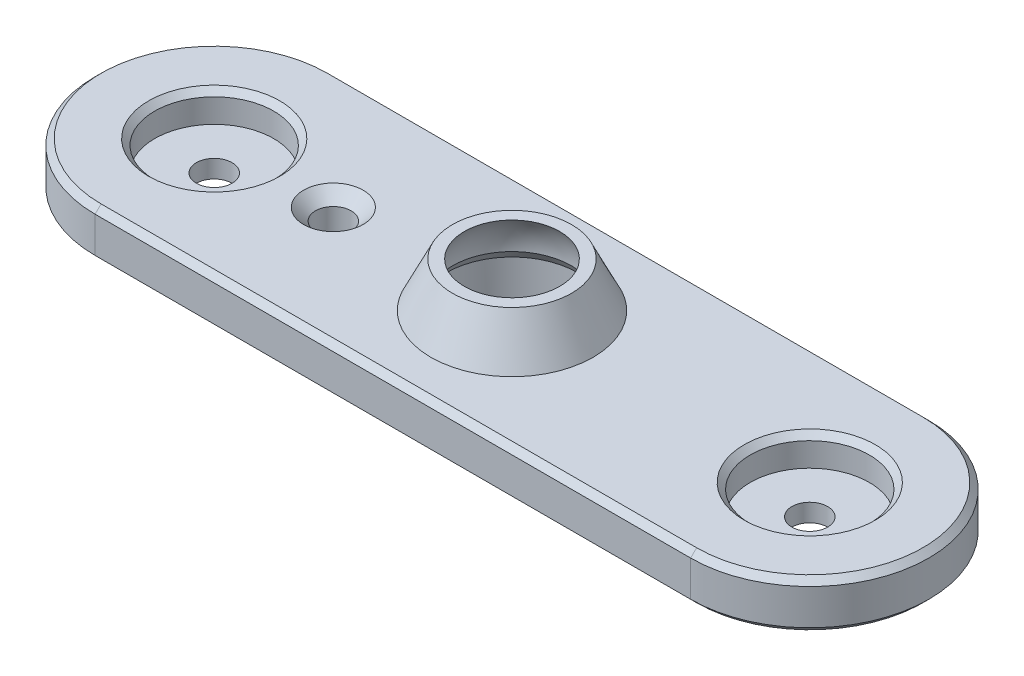
ISO-10303-21;
HEADER;
FILE_DESCRIPTION(('STEP AP214'),'2;1');
FILE_NAME('part.step','',(''),(''),'','','');
FILE_SCHEMA(('AUTOMOTIVE_DESIGN { 1 0 10303 214 1 1 1 1 }'));
ENDSEC;
DATA;
#1=APPLICATION_CONTEXT('core data for automotive mechanical design processes');
#2=APPLICATION_PROTOCOL_DEFINITION('international standard','automotive_design',2000,#1);
#3=PRODUCT_CONTEXT('',#1,'mechanical');
#4=PRODUCT('Part','Part','',(#3));
#5=PRODUCT_RELATED_PRODUCT_CATEGORY('part','',(#4));
#6=PRODUCT_DEFINITION_FORMATION('','',#4);
#7=PRODUCT_DEFINITION_CONTEXT('part definition',#1,'design');
#8=PRODUCT_DEFINITION('design','',#6,#7);
#9=PRODUCT_DEFINITION_SHAPE('','',#8);
#10=(LENGTH_UNIT() NAMED_UNIT(*) SI_UNIT(.MILLI.,.METRE.));
#11=(NAMED_UNIT(*) PLANE_ANGLE_UNIT() SI_UNIT($,.RADIAN.));
#12=(NAMED_UNIT(*) SI_UNIT($,.STERADIAN.) SOLID_ANGLE_UNIT());
#13=UNCERTAINTY_MEASURE_WITH_UNIT(LENGTH_MEASURE(1.E-05),#10,'distance_accuracy_value','');
#14=(GEOMETRIC_REPRESENTATION_CONTEXT(3) GLOBAL_UNCERTAINTY_ASSIGNED_CONTEXT((#13)) GLOBAL_UNIT_ASSIGNED_CONTEXT((#10,
#11,#12)) REPRESENTATION_CONTEXT('',''));
#15=CARTESIAN_POINT('',(0.,0.,0.));
#16=DIRECTION('',(0.,0.,1.));
#17=DIRECTION('',(1.,0.,0.));
#18=AXIS2_PLACEMENT_3D('',#15,#16,#17);
#19=CARTESIAN_POINT('',(25.,4.,0.));
#20=DIRECTION('',(0.,-1.,0.));
#21=DIRECTION('',(0.,0.,-1.));
#22=AXIS2_PLACEMENT_3D('',#19,#20,#21);
#23=CYLINDRICAL_SURFACE('',#22,1.5);
#24=CARTESIAN_POINT('',(25.,0.,0.));
#25=DIRECTION('',(0.,1.,0.));
#26=DIRECTION('',(0.,0.,1.));
#27=AXIS2_PLACEMENT_3D('',#24,#25,#26);
#28=CIRCLE('',#27,1.5);
#29=CARTESIAN_POINT('',(25.,0.,1.49999999999999));
#30=VERTEX_POINT('',#29);
#31=EDGE_CURVE('E208',#30,#30,#28,.T.);
#32=ORIENTED_EDGE('',*,*,#31,.F.);
#33=EDGE_LOOP('',(#32));
#34=FACE_BOUND('',#33,.T.);
#35=CARTESIAN_POINT('',(25.,1.5,0.));
#36=DIRECTION('',(0.,1.,0.));
#37=DIRECTION('',(0.,0.,1.));
#38=AXIS2_PLACEMENT_3D('',#35,#36,#37);
#39=CIRCLE('',#38,1.5);
#40=CARTESIAN_POINT('',(25.,1.5,1.49999999999999));
#41=VERTEX_POINT('',#40);
#42=EDGE_CURVE('E200',#41,#41,#39,.T.);
#43=ORIENTED_EDGE('',*,*,#42,.T.);
#44=EDGE_LOOP('',(#43));
#45=FACE_BOUND('',#44,.T.);
#46=ADVANCED_FACE('F34',(#34,#45),#23,.F.);
#47=CARTESIAN_POINT('',(-25.,4.,0.));
#48=DIRECTION('',(0.,-1.,0.));
#49=DIRECTION('',(0.,0.,-1.));
#50=AXIS2_PLACEMENT_3D('',#47,#48,#49);
#51=CYLINDRICAL_SURFACE('',#50,1.5);
#52=CARTESIAN_POINT('',(-25.,0.,0.));
#53=DIRECTION('',(0.,1.,0.));
#54=DIRECTION('',(0.,0.,1.));
#55=AXIS2_PLACEMENT_3D('',#52,#53,#54);
#56=CIRCLE('',#55,1.5);
#57=CARTESIAN_POINT('',(-25.,0.,1.5));
#58=VERTEX_POINT('',#57);
#59=EDGE_CURVE('E220',#58,#58,#56,.T.);
#60=ORIENTED_EDGE('',*,*,#59,.F.);
#61=EDGE_LOOP('',(#60));
#62=FACE_BOUND('',#61,.T.);
#63=CARTESIAN_POINT('',(-25.,1.5,0.));
#64=DIRECTION('',(0.,1.,0.));
#65=DIRECTION('',(0.,0.,1.));
#66=AXIS2_PLACEMENT_3D('',#63,#64,#65);
#67=CIRCLE('',#66,1.5);
#68=CARTESIAN_POINT('',(-25.,1.5,1.5));
#69=VERTEX_POINT('',#68);
#70=EDGE_CURVE('E205',#69,#69,#67,.T.);
#71=ORIENTED_EDGE('',*,*,#70,.T.);
#72=EDGE_LOOP('',(#71));
#73=FACE_BOUND('',#72,.T.);
#74=ADVANCED_FACE('F265',(#62,#73),#51,.F.);
#75=CARTESIAN_POINT('',(-25.,4.,0.));
#76=DIRECTION('',(0.,1.,0.));
#77=DIRECTION('',(0.,0.,1.));
#78=AXIS2_PLACEMENT_3D('',#75,#76,#77);
#79=PLANE('',#78);
#80=CARTESIAN_POINT('',(-25.,4.,0.));
#81=DIRECTION('',(0.,1.,0.));
#82=DIRECTION('',(0.,0.,1.));
#83=AXIS2_PLACEMENT_3D('',#80,#81,#82);
#84=CIRCLE('',#83,5.50000000000001);
#85=CARTESIAN_POINT('',(-25.,4.,5.50000000000001));
#86=VERTEX_POINT('',#85);
#87=EDGE_CURVE('E174',#86,#86,#84,.F.);
#88=ORIENTED_EDGE('',*,*,#87,.T.);
#89=EDGE_LOOP('',(#88));
#90=FACE_BOUND('',#89,.T.);
#91=CARTESIAN_POINT('',(25.,4.,0.));
#92=DIRECTION('',(0.,1.,0.));
#93=DIRECTION('',(0.,0.,1.));
#94=AXIS2_PLACEMENT_3D('',#91,#92,#93);
#95=CIRCLE('',#94,5.50000000000001);
#96=CARTESIAN_POINT('',(25.,4.,5.5));
#97=VERTEX_POINT('',#96);
#98=EDGE_CURVE('E177',#97,#97,#95,.F.);
#99=ORIENTED_EDGE('',*,*,#98,.T.);
#100=EDGE_LOOP('',(#99));
#101=FACE_BOUND('',#100,.T.);
#102=CARTESIAN_POINT('',(25.,4.,0.));
#103=DIRECTION('',(0.,1.,0.));
#104=DIRECTION('',(0.,0.,1.));
#105=AXIS2_PLACEMENT_3D('',#102,#103,#104);
#106=CIRCLE('',#105,9.50000000000002);
#107=CARTESIAN_POINT('',(25.,4.,9.50000000000001));
#108=VERTEX_POINT('',#107);
#109=CARTESIAN_POINT('',(25.,4.,-9.50000000000002));
#110=VERTEX_POINT('',#109);
#111=EDGE_CURVE('E112',#108,#110,#106,.T.);
#112=ORIENTED_EDGE('',*,*,#111,.T.);
#113=DIRECTION('',(-1.,0.,0.));
#114=VECTOR('',#113,1.);
#115=CARTESIAN_POINT('',(-25.,4.,-9.50000000000002));
#116=LINE('',#115,#114);
#117=CARTESIAN_POINT('',(-25.,4.,-9.50000000000002));
#118=VERTEX_POINT('',#117);
#119=EDGE_CURVE('E108',#110,#118,#116,.T.);
#120=ORIENTED_EDGE('',*,*,#119,.T.);
#121=CARTESIAN_POINT('',(-25.,4.,0.));
#122=DIRECTION('',(0.,1.,0.));
#123=DIRECTION('',(0.,0.,1.));
#124=AXIS2_PLACEMENT_3D('',#121,#122,#123);
#125=CIRCLE('',#124,9.50000000000002);
#126=CARTESIAN_POINT('',(-25.,4.,9.50000000000002));
#127=VERTEX_POINT('',#126);
#128=EDGE_CURVE('E101',#118,#127,#125,.T.);
#129=ORIENTED_EDGE('',*,*,#128,.T.);
#130=DIRECTION('',(1.,0.,0.));
#131=VECTOR('',#130,1.);
#132=CARTESIAN_POINT('',(25.,4.,9.50000000000001));
#133=LINE('',#132,#131);
#134=EDGE_CURVE('E105',#127,#108,#133,.T.);
#135=ORIENTED_EDGE('',*,*,#134,.T.);
#136=EDGE_LOOP('',(#112,#120,#129,#135));
#137=FACE_BOUND('',#136,.T.);
#138=CARTESIAN_POINT('',(-15.,4.,0.));
#139=DIRECTION('',(0.,1.,0.));
#140=DIRECTION('',(0.,0.,1.));
#141=AXIS2_PLACEMENT_3D('',#138,#139,#140);
#142=CIRCLE('',#141,2.5);
#143=CARTESIAN_POINT('',(-15.,4.,2.5));
#144=VERTEX_POINT('',#143);
#145=EDGE_CURVE('E184',#144,#144,#142,.F.);
#146=ORIENTED_EDGE('',*,*,#145,.T.);
#147=EDGE_LOOP('',(#146));
#148=FACE_BOUND('',#147,.T.);
#149=CARTESIAN_POINT('',(0.,4.,0.));
#150=DIRECTION('',(0.,1.,0.));
#151=DIRECTION('',(0.,0.,1.));
#152=AXIS2_PLACEMENT_3D('',#149,#150,#151);
#153=CIRCLE('',#152,6.8125);
#154=CARTESIAN_POINT('',(0.,4.,6.8125));
#155=VERTEX_POINT('',#154);
#156=EDGE_CURVE('E196',#155,#155,#153,.T.);
#157=ORIENTED_EDGE('',*,*,#156,.F.);
#158=EDGE_LOOP('',(#157));
#159=FACE_BOUND('',#158,.T.);
#160=ADVANCED_FACE('F103',(#90,#101,#137,#148,#159),#79,.T.);
#161=CARTESIAN_POINT('',(-25.,0.,0.));
#162=DIRECTION('',(0.,1.,0.));
#163=DIRECTION('',(0.,0.,1.));
#164=AXIS2_PLACEMENT_3D('',#161,#162,#163);
#165=PLANE('',#164);
#166=CARTESIAN_POINT('',(-25.,0.,0.));
#167=DIRECTION('',(0.,1.,0.));
#168=DIRECTION('',(0.,0.,1.));
#169=AXIS2_PLACEMENT_3D('',#166,#167,#168);
#170=CIRCLE('',#169,9.50000000000002);
#171=CARTESIAN_POINT('',(-25.,0.,9.50000000000002));
#172=VERTEX_POINT('',#171);
#173=CARTESIAN_POINT('',(-25.,0.,-9.50000000000002));
#174=VERTEX_POINT('',#173);
#175=EDGE_CURVE('E43',#172,#174,#170,.F.);
#176=ORIENTED_EDGE('',*,*,#175,.T.);
#177=DIRECTION('',(1.,0.,0.));
#178=VECTOR('',#177,1.);
#179=CARTESIAN_POINT('',(-25.,0.,-9.50000000000002));
#180=LINE('',#179,#178);
#181=CARTESIAN_POINT('',(25.,0.,-9.50000000000002));
#182=VERTEX_POINT('',#181);
#183=EDGE_CURVE('E11',#174,#182,#180,.T.);
#184=ORIENTED_EDGE('',*,*,#183,.T.);
#185=CARTESIAN_POINT('',(25.,0.,0.));
#186=DIRECTION('',(0.,1.,0.));
#187=DIRECTION('',(0.,0.,1.));
#188=AXIS2_PLACEMENT_3D('',#185,#186,#187);
#189=CIRCLE('',#188,9.50000000000002);
#190=CARTESIAN_POINT('',(25.,0.,9.50000000000001));
#191=VERTEX_POINT('',#190);
#192=EDGE_CURVE('E150',#182,#191,#189,.F.);
#193=ORIENTED_EDGE('',*,*,#192,.T.);
#194=DIRECTION('',(-1.,0.,0.));
#195=VECTOR('',#194,1.);
#196=CARTESIAN_POINT('',(-25.,0.,9.50000000000002));
#197=LINE('',#196,#195);
#198=EDGE_CURVE('E152',#191,#172,#197,.T.);
#199=ORIENTED_EDGE('',*,*,#198,.T.);
#200=EDGE_LOOP('',(#176,#184,#193,#199));
#201=FACE_BOUND('',#200,.T.);
#202=CARTESIAN_POINT('',(-15.,0.,0.));
#203=DIRECTION('',(0.,1.,0.));
#204=DIRECTION('',(0.,0.,1.));
#205=AXIS2_PLACEMENT_3D('',#202,#203,#204);
#206=CIRCLE('',#205,2.5);
#207=CARTESIAN_POINT('',(-15.,0.,2.5));
#208=VERTEX_POINT('',#207);
#209=EDGE_CURVE('E193',#208,#208,#206,.T.);
#210=ORIENTED_EDGE('',*,*,#209,.T.);
#211=EDGE_LOOP('',(#210));
#212=FACE_BOUND('',#211,.T.);
#213=CARTESIAN_POINT('',(0.,0.,0.));
#214=DIRECTION('',(0.,1.,0.));
#215=DIRECTION('',(0.,0.,1.));
#216=AXIS2_PLACEMENT_3D('',#213,#214,#215);
#217=CIRCLE('',#216,5.5);
#218=CARTESIAN_POINT('',(0.,0.,5.5));
#219=VERTEX_POINT('',#218);
#220=EDGE_CURVE('E229',#219,#219,#217,.T.);
#221=ORIENTED_EDGE('',*,*,#220,.T.);
#222=EDGE_LOOP('',(#221));
#223=FACE_BOUND('',#222,.T.);
#224=ORIENTED_EDGE('',*,*,#31,.T.);
#225=EDGE_LOOP('',(#224));
#226=FACE_BOUND('',#225,.T.);
#227=ORIENTED_EDGE('',*,*,#59,.T.);
#228=EDGE_LOOP('',(#227));
#229=FACE_BOUND('',#228,.T.);
#230=ADVANCED_FACE('F281',(#201,#212,#223,#226,#229),#165,.F.);
#231=CARTESIAN_POINT('',(-25.,4.,0.));
#232=DIRECTION('',(0.,-1.,0.));
#233=DIRECTION('',(0.,0.,-1.));
#234=AXIS2_PLACEMENT_3D('',#231,#232,#233);
#235=CYLINDRICAL_SURFACE('',#234,10.);
#236=DIRECTION('',(0.,-1.,0.));
#237=VECTOR('',#236,1.);
#238=CARTESIAN_POINT('',(-25.,4.,10.));
#239=LINE('',#238,#237);
#240=CARTESIAN_POINT('',(-25.,3.50000000000001,10.));
#241=VERTEX_POINT('',#240);
#242=CARTESIAN_POINT('',(-25.,0.499999999999987,10.));
#243=VERTEX_POINT('',#242);
#244=EDGE_CURVE('E199',#241,#243,#239,.T.);
#245=ORIENTED_EDGE('',*,*,#244,.F.);
#246=CARTESIAN_POINT('',(-25.,3.50000000000001,0.));
#247=DIRECTION('',(0.,1.,0.));
#248=DIRECTION('',(0.,0.,1.));
#249=AXIS2_PLACEMENT_3D('',#246,#247,#248);
#250=CIRCLE('',#249,10.);
#251=CARTESIAN_POINT('',(-25.,3.50000000000001,-10.));
#252=VERTEX_POINT('',#251);
#253=EDGE_CURVE('E126',#241,#252,#250,.F.);
#254=ORIENTED_EDGE('',*,*,#253,.T.);
#255=DIRECTION('',(0.,-1.,0.));
#256=VECTOR('',#255,1.);
#257=CARTESIAN_POINT('',(-25.,4.,-10.));
#258=LINE('',#257,#256);
#259=CARTESIAN_POINT('',(-25.,0.499999999999987,-10.));
#260=VERTEX_POINT('',#259);
#261=EDGE_CURVE('E217',#252,#260,#258,.T.);
#262=ORIENTED_EDGE('',*,*,#261,.T.);
#263=CARTESIAN_POINT('',(-25.,0.499999999999987,0.));
#264=DIRECTION('',(0.,1.,0.));
#265=DIRECTION('',(0.,0.,1.));
#266=AXIS2_PLACEMENT_3D('',#263,#264,#265);
#267=CIRCLE('',#266,10.);
#268=EDGE_CURVE('E163',#260,#243,#267,.T.);
#269=ORIENTED_EDGE('',*,*,#268,.T.);
#270=EDGE_LOOP('',(#245,#254,#262,#269));
#271=FACE_BOUND('',#270,.T.);
#272=ADVANCED_FACE('F285',(#271),#235,.T.);
#273=CARTESIAN_POINT('',(-25.,4.,10.));
#274=DIRECTION('',(0.,0.,-1.));
#275=DIRECTION('',(-1.,0.,0.));
#276=AXIS2_PLACEMENT_3D('',#273,#274,#275);
#277=PLANE('',#276);
#278=DIRECTION('',(0.,-1.,0.));
#279=VECTOR('',#278,1.);
#280=CARTESIAN_POINT('',(25.,4.,9.99999999999999));
#281=LINE('',#280,#279);
#282=CARTESIAN_POINT('',(25.,3.50000000000001,9.99999999999999));
#283=VERTEX_POINT('',#282);
#284=CARTESIAN_POINT('',(25.,0.499999999999987,9.99999999999999));
#285=VERTEX_POINT('',#284);
#286=EDGE_CURVE('E211',#283,#285,#281,.T.);
#287=ORIENTED_EDGE('',*,*,#286,.F.);
#288=DIRECTION('',(-1.,0.,0.));
#289=VECTOR('',#288,1.);
#290=CARTESIAN_POINT('',(-25.,3.50000000000001,10.));
#291=LINE('',#290,#289);
#292=EDGE_CURVE('E154',#283,#241,#291,.T.);
#293=ORIENTED_EDGE('',*,*,#292,.T.);
#294=ORIENTED_EDGE('',*,*,#244,.T.);
#295=DIRECTION('',(1.,0.,0.));
#296=VECTOR('',#295,1.);
#297=CARTESIAN_POINT('',(-25.,0.499999999999987,10.));
#298=LINE('',#297,#296);
#299=EDGE_CURVE('E156',#243,#285,#298,.T.);
#300=ORIENTED_EDGE('',*,*,#299,.T.);
#301=EDGE_LOOP('',(#287,#293,#294,#300));
#302=FACE_BOUND('',#301,.T.);
#303=ADVANCED_FACE('F293',(#302),#277,.F.);
#304=CARTESIAN_POINT('',(25.,4.,0.));
#305=DIRECTION('',(0.,-1.,0.));
#306=DIRECTION('',(0.,0.,-1.));
#307=AXIS2_PLACEMENT_3D('',#304,#305,#306);
#308=CYLINDRICAL_SURFACE('',#307,10.);
#309=DIRECTION('',(0.,-1.,0.));
#310=VECTOR('',#309,1.);
#311=CARTESIAN_POINT('',(25.,4.,-10.));
#312=LINE('',#311,#310);
#313=CARTESIAN_POINT('',(25.,3.50000000000001,-10.));
#314=VERTEX_POINT('',#313);
#315=CARTESIAN_POINT('',(25.,0.499999999999987,-10.));
#316=VERTEX_POINT('',#315);
#317=EDGE_CURVE('E214',#314,#316,#312,.T.);
#318=ORIENTED_EDGE('',*,*,#317,.F.);
#319=CARTESIAN_POINT('',(25.,3.50000000000001,0.));
#320=DIRECTION('',(0.,1.,0.));
#321=DIRECTION('',(0.,0.,1.));
#322=AXIS2_PLACEMENT_3D('',#319,#320,#321);
#323=CIRCLE('',#322,10.);
#324=EDGE_CURVE('E158',#314,#283,#323,.F.);
#325=ORIENTED_EDGE('',*,*,#324,.T.);
#326=ORIENTED_EDGE('',*,*,#286,.T.);
#327=CARTESIAN_POINT('',(25.,0.499999999999987,0.));
#328=DIRECTION('',(0.,1.,0.));
#329=DIRECTION('',(0.,0.,1.));
#330=AXIS2_PLACEMENT_3D('',#327,#328,#329);
#331=CIRCLE('',#330,10.);
#332=EDGE_CURVE('E160',#285,#316,#331,.T.);
#333=ORIENTED_EDGE('',*,*,#332,.T.);
#334=EDGE_LOOP('',(#318,#325,#326,#333));
#335=FACE_BOUND('',#334,.T.);
#336=ADVANCED_FACE('F289',(#335),#308,.T.);
#337=CARTESIAN_POINT('',(-25.,4.,-10.));
#338=DIRECTION('',(0.,0.,1.));
#339=DIRECTION('',(1.,0.,0.));
#340=AXIS2_PLACEMENT_3D('',#337,#338,#339);
#341=PLANE('',#340);
#342=ORIENTED_EDGE('',*,*,#261,.F.);
#343=DIRECTION('',(1.,0.,0.));
#344=VECTOR('',#343,1.);
#345=CARTESIAN_POINT('',(25.,3.50000000000001,-10.));
#346=LINE('',#345,#344);
#347=EDGE_CURVE('E165',#252,#314,#346,.T.);
#348=ORIENTED_EDGE('',*,*,#347,.T.);
#349=ORIENTED_EDGE('',*,*,#317,.T.);
#350=DIRECTION('',(-1.,0.,0.));
#351=VECTOR('',#350,1.);
#352=CARTESIAN_POINT('',(-25.,0.499999999999987,-10.));
#353=LINE('',#352,#351);
#354=EDGE_CURVE('E168',#316,#260,#353,.T.);
#355=ORIENTED_EDGE('',*,*,#354,.T.);
#356=EDGE_LOOP('',(#342,#348,#349,#355));
#357=FACE_BOUND('',#356,.T.);
#358=ADVANCED_FACE('F286',(#357),#341,.F.);
#359=CARTESIAN_POINT('',(-15.,4.,0.));
#360=DIRECTION('',(0.,-1.,0.));
#361=DIRECTION('',(0.,0.,-1.));
#362=AXIS2_PLACEMENT_3D('',#359,#360,#361);
#363=CYLINDRICAL_SURFACE('',#362,1.5);
#364=CARTESIAN_POINT('',(-15.,1.,0.));
#365=DIRECTION('',(0.,1.,0.));
#366=DIRECTION('',(0.,0.,1.));
#367=AXIS2_PLACEMENT_3D('',#364,#365,#366);
#368=CIRCLE('',#367,1.5);
#369=CARTESIAN_POINT('',(-15.,1.,1.5));
#370=VERTEX_POINT('',#369);
#371=EDGE_CURVE('E187',#370,#370,#368,.F.);
#372=ORIENTED_EDGE('',*,*,#371,.T.);
#373=EDGE_LOOP('',(#372));
#374=FACE_BOUND('',#373,.T.);
#375=CARTESIAN_POINT('',(-15.,3.,0.));
#376=DIRECTION('',(0.,1.,0.));
#377=DIRECTION('',(0.,0.,1.));
#378=AXIS2_PLACEMENT_3D('',#375,#376,#377);
#379=CIRCLE('',#378,1.5);
#380=CARTESIAN_POINT('',(-15.,3.,1.5));
#381=VERTEX_POINT('',#380);
#382=EDGE_CURVE('E190',#381,#381,#379,.T.);
#383=ORIENTED_EDGE('',*,*,#382,.T.);
#384=EDGE_LOOP('',(#383));
#385=FACE_BOUND('',#384,.T.);
#386=ADVANCED_FACE('F276',(#374,#385),#363,.F.);
#387=CARTESIAN_POINT('',(-25.,1.5,0.));
#388=DIRECTION('',(0.,1.,0.));
#389=DIRECTION('',(0.,0.,1.));
#390=AXIS2_PLACEMENT_3D('',#387,#388,#389);
#391=CYLINDRICAL_SURFACE('',#390,5.);
#392=CARTESIAN_POINT('',(-25.,3.49999999999999,0.));
#393=DIRECTION('',(0.,1.,0.));
#394=DIRECTION('',(0.,0.,1.));
#395=AXIS2_PLACEMENT_3D('',#392,#393,#394);
#396=CIRCLE('',#395,5.);
#397=CARTESIAN_POINT('',(-25.,3.49999999999999,5.));
#398=VERTEX_POINT('',#397);
#399=EDGE_CURVE('E123',#398,#398,#396,.T.);
#400=ORIENTED_EDGE('',*,*,#399,.T.);
#401=EDGE_LOOP('',(#400));
#402=FACE_BOUND('',#401,.T.);
#403=CARTESIAN_POINT('',(-25.,1.5,0.));
#404=DIRECTION('',(0.,1.,0.));
#405=DIRECTION('',(0.,0.,1.));
#406=AXIS2_PLACEMENT_3D('',#403,#404,#405);
#407=CIRCLE('',#406,5.);
#408=CARTESIAN_POINT('',(-25.,1.5,5.));
#409=VERTEX_POINT('',#408);
#410=EDGE_CURVE('E203',#409,#409,#407,.T.);
#411=ORIENTED_EDGE('',*,*,#410,.F.);
#412=EDGE_LOOP('',(#411));
#413=FACE_BOUND('',#412,.T.);
#414=ADVANCED_FACE('F362',(#402,#413),#391,.F.);
#415=CARTESIAN_POINT('',(-25.,1.5,0.));
#416=DIRECTION('',(0.,1.,0.));
#417=DIRECTION('',(0.,0.,1.));
#418=AXIS2_PLACEMENT_3D('',#415,#416,#417);
#419=PLANE('',#418);
#420=ORIENTED_EDGE('',*,*,#70,.F.);
#421=EDGE_LOOP('',(#420));
#422=FACE_BOUND('',#421,.T.);
#423=ORIENTED_EDGE('',*,*,#410,.T.);
#424=EDGE_LOOP('',(#423));
#425=FACE_BOUND('',#424,.T.);
#426=ADVANCED_FACE('F359',(#422,#425),#419,.T.);
#427=CARTESIAN_POINT('',(25.,1.5,0.));
#428=DIRECTION('',(0.,1.,0.));
#429=DIRECTION('',(0.,0.,1.));
#430=AXIS2_PLACEMENT_3D('',#427,#428,#429);
#431=CYLINDRICAL_SURFACE('',#430,5.);
#432=CARTESIAN_POINT('',(25.,3.49999999999999,0.));
#433=DIRECTION('',(0.,1.,0.));
#434=DIRECTION('',(0.,0.,1.));
#435=AXIS2_PLACEMENT_3D('',#432,#433,#434);
#436=CIRCLE('',#435,5.);
#437=CARTESIAN_POINT('',(25.,3.49999999999999,4.99999999999999));
#438=VERTEX_POINT('',#437);
#439=EDGE_CURVE('E171',#438,#438,#436,.T.);
#440=ORIENTED_EDGE('',*,*,#439,.T.);
#441=EDGE_LOOP('',(#440));
#442=FACE_BOUND('',#441,.T.);
#443=CARTESIAN_POINT('',(25.,1.5,0.));
#444=DIRECTION('',(0.,1.,0.));
#445=DIRECTION('',(0.,0.,1.));
#446=AXIS2_PLACEMENT_3D('',#443,#444,#445);
#447=CIRCLE('',#446,5.);
#448=CARTESIAN_POINT('',(25.,1.5,4.99999999999999));
#449=VERTEX_POINT('',#448);
#450=EDGE_CURVE('E204',#449,#449,#447,.T.);
#451=ORIENTED_EDGE('',*,*,#450,.F.);
#452=EDGE_LOOP('',(#451));
#453=FACE_BOUND('',#452,.T.);
#454=ADVANCED_FACE('F260',(#442,#453),#431,.F.);
#455=CARTESIAN_POINT('',(25.,1.5,0.));
#456=DIRECTION('',(0.,1.,0.));
#457=DIRECTION('',(0.,0.,1.));
#458=AXIS2_PLACEMENT_3D('',#455,#456,#457);
#459=PLANE('',#458);
#460=ORIENTED_EDGE('',*,*,#42,.F.);
#461=EDGE_LOOP('',(#460));
#462=FACE_BOUND('',#461,.T.);
#463=ORIENTED_EDGE('',*,*,#450,.T.);
#464=EDGE_LOOP('',(#463));
#465=FACE_BOUND('',#464,.T.);
#466=ADVANCED_FACE('F250',(#462,#465),#459,.T.);
#467=CARTESIAN_POINT('',(0.,0.,0.));
#468=DIRECTION('',(0.,1.,0.));
#469=DIRECTION('',(0.,0.,1.));
#470=AXIS2_PLACEMENT_3D('',#467,#468,#469);
#471=CYLINDRICAL_SURFACE('',#470,5.5);
#472=ORIENTED_EDGE('',*,*,#220,.F.);
#473=EDGE_LOOP('',(#472));
#474=FACE_BOUND('',#473,.T.);
#475=CARTESIAN_POINT('',(0.,4.,0.));
#476=DIRECTION('',(0.,-1.,0.));
#477=DIRECTION('',(0.,0.,-1.));
#478=AXIS2_PLACEMENT_3D('',#475,#476,#477);
#479=CIRCLE('',#478,5.5);
#480=CARTESIAN_POINT('',(0.,4.,-5.5));
#481=VERTEX_POINT('',#480);
#482=EDGE_CURVE('E129',#481,#481,#479,.T.);
#483=ORIENTED_EDGE('',*,*,#482,.F.);
#484=EDGE_LOOP('',(#483));
#485=FACE_BOUND('',#484,.T.);
#486=ADVANCED_FACE('F247',(#474,#485),#471,.F.);
#487=CARTESIAN_POINT('',(0.,4.,0.));
#488=DIRECTION('',(0.,-1.,0.));
#489=DIRECTION('',(0.,0.,-1.));
#490=AXIS2_PLACEMENT_3D('',#487,#488,#489);
#491=CONICAL_SURFACE('',#490,6.8125,0.450225596260715);
#492=CARTESIAN_POINT('',(0.,7.75,0.));
#493=DIRECTION('',(0.,-1.,0.));
#494=DIRECTION('',(0.,0.,-1.));
#495=AXIS2_PLACEMENT_3D('',#492,#493,#494);
#496=CIRCLE('',#495,5.);
#497=CARTESIAN_POINT('',(0.,7.75,-5.));
#498=VERTEX_POINT('',#497);
#499=EDGE_CURVE('E232',#498,#498,#496,.T.);
#500=ORIENTED_EDGE('',*,*,#499,.T.);
#501=EDGE_LOOP('',(#500));
#502=FACE_BOUND('',#501,.T.);
#503=ORIENTED_EDGE('',*,*,#156,.T.);
#504=EDGE_LOOP('',(#503));
#505=FACE_BOUND('',#504,.T.);
#506=ADVANCED_FACE('F249',(#502,#505),#491,.T.);
#507=CARTESIAN_POINT('',(4.,7.75,0.));
#508=DIRECTION('',(0.,1.,0.));
#509=DIRECTION('',(0.,0.,1.));
#510=AXIS2_PLACEMENT_3D('',#507,#508,#509);
#511=PLANE('',#510);
#512=CARTESIAN_POINT('',(0.,7.75,0.));
#513=DIRECTION('',(0.,-1.,0.));
#514=DIRECTION('',(0.,0.,-1.));
#515=AXIS2_PLACEMENT_3D('',#512,#513,#514);
#516=CIRCLE('',#515,4.);
#517=CARTESIAN_POINT('',(0.,7.75,-4.));
#518=VERTEX_POINT('',#517);
#519=EDGE_CURVE('E235',#518,#518,#516,.T.);
#520=ORIENTED_EDGE('',*,*,#519,.T.);
#521=EDGE_LOOP('',(#520));
#522=FACE_BOUND('',#521,.T.);
#523=ORIENTED_EDGE('',*,*,#499,.F.);
#524=EDGE_LOOP('',(#523));
#525=FACE_BOUND('',#524,.T.);
#526=ADVANCED_FACE('F257',(#522,#525),#511,.T.);
#527=CARTESIAN_POINT('',(0.,4.75,0.));
#528=DIRECTION('',(0.,-1.,0.));
#529=DIRECTION('',(1.,0.,0.));
#530=AXIS2_PLACEMENT_3D('',#527,#528,#529);
#531=SPHERICAL_SURFACE('',#530,5.);
#532=CARTESIAN_POINT('',(0.,4.75,0.));
#533=DIRECTION('',(0.,-1.,0.));
#534=DIRECTION('',(0.,0.,-1.));
#535=AXIS2_PLACEMENT_3D('',#532,#533,#534);
#536=CIRCLE('',#535,5.);
#537=CARTESIAN_POINT('',(0.,4.75,-5.));
#538=VERTEX_POINT('',#537);
#539=EDGE_CURVE('E238',#538,#538,#536,.T.);
#540=ORIENTED_EDGE('',*,*,#539,.T.);
#541=EDGE_LOOP('',(#540));
#542=FACE_BOUND('',#541,.T.);
#543=ORIENTED_EDGE('',*,*,#519,.F.);
#544=EDGE_LOOP('',(#543));
#545=FACE_BOUND('',#544,.T.);
#546=ADVANCED_FACE('F453',(#542,#545),#531,.F.);
#547=CARTESIAN_POINT('',(0.,4.75,0.));
#548=DIRECTION('',(0.,-1.,0.));
#549=DIRECTION('',(0.,0.,-1.));
#550=AXIS2_PLACEMENT_3D('',#547,#548,#549);
#551=CONICAL_SURFACE('',#550,5.,0.588002603547567);
#552=ORIENTED_EDGE('',*,*,#482,.T.);
#553=EDGE_LOOP('',(#552));
#554=FACE_BOUND('',#553,.T.);
#555=ORIENTED_EDGE('',*,*,#539,.F.);
#556=EDGE_LOOP('',(#555));
#557=FACE_BOUND('',#556,.T.);
#558=ADVANCED_FACE('F244',(#554,#557),#551,.F.);
#559=CARTESIAN_POINT('',(-15.,0.,0.));
#560=DIRECTION('',(0.,-1.,0.));
#561=DIRECTION('',(0.,0.,-1.));
#562=AXIS2_PLACEMENT_3D('',#559,#560,#561);
#563=CONICAL_SURFACE('',#562,2.5,0.785398163397444);
#564=ORIENTED_EDGE('',*,*,#371,.F.);
#565=EDGE_LOOP('',(#564));
#566=FACE_BOUND('',#565,.T.);
#567=ORIENTED_EDGE('',*,*,#209,.F.);
#568=EDGE_LOOP('',(#567));
#569=FACE_BOUND('',#568,.T.);
#570=ADVANCED_FACE('F301',(#566,#569),#563,.F.);
#571=CARTESIAN_POINT('',(-15.,3.,0.));
#572=DIRECTION('',(0.,1.,0.));
#573=DIRECTION('',(0.,0.,1.));
#574=AXIS2_PLACEMENT_3D('',#571,#572,#573);
#575=CONICAL_SURFACE('',#574,1.5,0.785398163397449);
#576=ORIENTED_EDGE('',*,*,#145,.F.);
#577=EDGE_LOOP('',(#576));
#578=FACE_BOUND('',#577,.T.);
#579=ORIENTED_EDGE('',*,*,#382,.F.);
#580=EDGE_LOOP('',(#579));
#581=FACE_BOUND('',#580,.T.);
#582=ADVANCED_FACE('F304',(#578,#581),#575,.F.);
#583=CARTESIAN_POINT('',(-25.,3.49999999999999,0.));
#584=DIRECTION('',(0.,1.,0.));
#585=DIRECTION('',(0.,0.,1.));
#586=AXIS2_PLACEMENT_3D('',#583,#584,#585);
#587=CONICAL_SURFACE('',#586,5.,0.785398163397445);
#588=ORIENTED_EDGE('',*,*,#87,.F.);
#589=EDGE_LOOP('',(#588));
#590=FACE_BOUND('',#589,.T.);
#591=ORIENTED_EDGE('',*,*,#399,.F.);
#592=EDGE_LOOP('',(#591));
#593=FACE_BOUND('',#592,.T.);
#594=ADVANCED_FACE('F308',(#590,#593),#587,.F.);
#595=CARTESIAN_POINT('',(25.,3.49999999999999,0.));
#596=DIRECTION('',(0.,1.,0.));
#597=DIRECTION('',(0.,0.,1.));
#598=AXIS2_PLACEMENT_3D('',#595,#596,#597);
#599=CONICAL_SURFACE('',#598,5.,0.785398163397445);
#600=ORIENTED_EDGE('',*,*,#98,.F.);
#601=EDGE_LOOP('',(#600));
#602=FACE_BOUND('',#601,.T.);
#603=ORIENTED_EDGE('',*,*,#439,.F.);
#604=EDGE_LOOP('',(#603));
#605=FACE_BOUND('',#604,.T.);
#606=ADVANCED_FACE('F312',(#602,#605),#599,.F.);
#607=CARTESIAN_POINT('',(-25.,4.,9.50000000000002));
#608=DIRECTION('',(0.,0.707106781186548,0.707106781186548));
#609=DIRECTION('',(-1.,0.,0.));
#610=AXIS2_PLACEMENT_3D('',#607,#608,#609);
#611=PLANE('',#610);
#612=DIRECTION('',(0.,0.707106781186548,-0.707106781186548));
#613=VECTOR('',#612,1.);
#614=CARTESIAN_POINT('',(-25.,3.50000000000001,10.));
#615=LINE('',#614,#613);
#616=EDGE_CURVE('E118',#241,#127,#615,.T.);
#617=ORIENTED_EDGE('',*,*,#616,.F.);
#618=ORIENTED_EDGE('',*,*,#292,.F.);
#619=DIRECTION('',(0.,-0.707106781186548,0.707106781186548));
#620=VECTOR('',#619,1.);
#621=CARTESIAN_POINT('',(25.,4.,9.50000000000001));
#622=LINE('',#621,#620);
#623=EDGE_CURVE('E121',#108,#283,#622,.T.);
#624=ORIENTED_EDGE('',*,*,#623,.F.);
#625=ORIENTED_EDGE('',*,*,#134,.F.);
#626=EDGE_LOOP('',(#617,#618,#624,#625));
#627=FACE_BOUND('',#626,.T.);
#628=ADVANCED_FACE('F116',(#627),#611,.T.);
#629=CARTESIAN_POINT('',(25.,4.,0.));
#630=DIRECTION('',(0.,-1.,0.));
#631=DIRECTION('',(0.,0.,-1.));
#632=AXIS2_PLACEMENT_3D('',#629,#630,#631);
#633=CONICAL_SURFACE('',#632,9.50000000000002,0.785398163397448);
#634=ORIENTED_EDGE('',*,*,#623,.T.);
#635=ORIENTED_EDGE('',*,*,#324,.F.);
#636=DIRECTION('',(0.,-0.707106781186548,-0.707106781186548));
#637=VECTOR('',#636,1.);
#638=CARTESIAN_POINT('',(25.,4.,-9.50000000000002));
#639=LINE('',#638,#637);
#640=EDGE_CURVE('E127',#110,#314,#639,.T.);
#641=ORIENTED_EDGE('',*,*,#640,.F.);
#642=ORIENTED_EDGE('',*,*,#111,.F.);
#643=EDGE_LOOP('',(#634,#635,#641,#642));
#644=FACE_BOUND('',#643,.T.);
#645=ADVANCED_FACE('F322',(#644),#633,.T.);
#646=CARTESIAN_POINT('',(-25.,4.,0.));
#647=DIRECTION('',(0.,-1.,0.));
#648=DIRECTION('',(0.,0.,-1.));
#649=AXIS2_PLACEMENT_3D('',#646,#647,#648);
#650=CONICAL_SURFACE('',#649,9.50000000000002,0.785398163397448);
#651=ORIENTED_EDGE('',*,*,#616,.T.);
#652=ORIENTED_EDGE('',*,*,#128,.F.);
#653=DIRECTION('',(0.,0.707106781186548,0.707106781186548));
#654=VECTOR('',#653,1.);
#655=CARTESIAN_POINT('',(-25.,3.50000000000001,-10.));
#656=LINE('',#655,#654);
#657=EDGE_CURVE('E131',#252,#118,#656,.T.);
#658=ORIENTED_EDGE('',*,*,#657,.F.);
#659=ORIENTED_EDGE('',*,*,#253,.F.);
#660=EDGE_LOOP('',(#651,#652,#658,#659));
#661=FACE_BOUND('',#660,.T.);
#662=ADVANCED_FACE('F125',(#661),#650,.T.);
#663=CARTESIAN_POINT('',(-25.,4.,-9.50000000000002));
#664=DIRECTION('',(0.,0.707106781186548,-0.707106781186548));
#665=DIRECTION('',(1.,0.,0.));
#666=AXIS2_PLACEMENT_3D('',#663,#664,#665);
#667=PLANE('',#666);
#668=ORIENTED_EDGE('',*,*,#640,.T.);
#669=ORIENTED_EDGE('',*,*,#347,.F.);
#670=ORIENTED_EDGE('',*,*,#657,.T.);
#671=ORIENTED_EDGE('',*,*,#119,.F.);
#672=EDGE_LOOP('',(#668,#669,#670,#671));
#673=FACE_BOUND('',#672,.T.);
#674=ADVANCED_FACE('F317',(#673),#667,.T.);
#675=CARTESIAN_POINT('',(-25.,0.499999999999987,10.));
#676=DIRECTION('',(0.,0.707106781186548,-0.707106781186548));
#677=DIRECTION('',(1.,0.,0.));
#678=AXIS2_PLACEMENT_3D('',#675,#676,#677);
#679=PLANE('',#678);
#680=DIRECTION('',(0.,0.707106781186548,0.707106781186548));
#681=VECTOR('',#680,1.);
#682=CARTESIAN_POINT('',(-25.,0.,9.50000000000002));
#683=LINE('',#682,#681);
#684=EDGE_CURVE('E137',#172,#243,#683,.T.);
#685=ORIENTED_EDGE('',*,*,#684,.F.);
#686=ORIENTED_EDGE('',*,*,#198,.F.);
#687=DIRECTION('',(0.,-0.707106781186548,-0.707106781186548));
#688=VECTOR('',#687,1.);
#689=CARTESIAN_POINT('',(25.,0.499999999999987,9.99999999999999));
#690=LINE('',#689,#688);
#691=EDGE_CURVE('E38',#285,#191,#690,.T.);
#692=ORIENTED_EDGE('',*,*,#691,.F.);
#693=ORIENTED_EDGE('',*,*,#299,.F.);
#694=EDGE_LOOP('',(#685,#686,#692,#693));
#695=FACE_BOUND('',#694,.T.);
#696=ADVANCED_FACE('F36',(#695),#679,.F.);
#697=CARTESIAN_POINT('',(25.,0.499999999999987,0.));
#698=DIRECTION('',(0.,1.,0.));
#699=DIRECTION('',(0.,0.,1.));
#700=AXIS2_PLACEMENT_3D('',#697,#698,#699);
#701=CONICAL_SURFACE('',#700,10.,0.785398163397448);
#702=ORIENTED_EDGE('',*,*,#691,.T.);
#703=ORIENTED_EDGE('',*,*,#192,.F.);
#704=DIRECTION('',(0.,-0.707106781186548,0.707106781186548));
#705=VECTOR('',#704,1.);
#706=CARTESIAN_POINT('',(25.,0.499999999999987,-10.));
#707=LINE('',#706,#705);
#708=EDGE_CURVE('E56',#316,#182,#707,.T.);
#709=ORIENTED_EDGE('',*,*,#708,.F.);
#710=ORIENTED_EDGE('',*,*,#332,.F.);
#711=EDGE_LOOP('',(#702,#703,#709,#710));
#712=FACE_BOUND('',#711,.T.);
#713=ADVANCED_FACE('F333',(#712),#701,.T.);
#714=CARTESIAN_POINT('',(-25.,0.499999999999987,0.));
#715=DIRECTION('',(0.,1.,0.));
#716=DIRECTION('',(0.,0.,1.));
#717=AXIS2_PLACEMENT_3D('',#714,#715,#716);
#718=CONICAL_SURFACE('',#717,10.,0.785398163397448);
#719=ORIENTED_EDGE('',*,*,#684,.T.);
#720=ORIENTED_EDGE('',*,*,#268,.F.);
#721=DIRECTION('',(0.,0.707106781186548,-0.707106781186548));
#722=VECTOR('',#721,1.);
#723=CARTESIAN_POINT('',(-25.,0.,-9.50000000000002));
#724=LINE('',#723,#722);
#725=EDGE_CURVE('E135',#174,#260,#724,.T.);
#726=ORIENTED_EDGE('',*,*,#725,.F.);
#727=ORIENTED_EDGE('',*,*,#175,.F.);
#728=EDGE_LOOP('',(#719,#720,#726,#727));
#729=FACE_BOUND('',#728,.T.);
#730=ADVANCED_FACE('F331',(#729),#718,.T.);
#731=CARTESIAN_POINT('',(-25.,0.499999999999987,-10.));
#732=DIRECTION('',(0.,0.707106781186548,0.707106781186548));
#733=DIRECTION('',(-1.,0.,0.));
#734=AXIS2_PLACEMENT_3D('',#731,#732,#733);
#735=PLANE('',#734);
#736=ORIENTED_EDGE('',*,*,#708,.T.);
#737=ORIENTED_EDGE('',*,*,#183,.F.);
#738=ORIENTED_EDGE('',*,*,#725,.T.);
#739=ORIENTED_EDGE('',*,*,#354,.F.);
#740=EDGE_LOOP('',(#736,#737,#738,#739));
#741=FACE_BOUND('',#740,.T.);
#742=ADVANCED_FACE('F328',(#741),#735,.F.);
#743=CLOSED_SHELL('',(#46,#74,#160,#230,#272,#303,#336,#358,#386,#414,#426,#454,#466,#486,#506,
#526,#546,#558,#570,#582,#594,#606,#628,#645,#662,#674,#696,#713,#730,#742));
#744=MANIFOLD_SOLID_BREP('B2',#743);
#745=ADVANCED_BREP_SHAPE_REPRESENTATION('',(#18,#744),#14);
#746=SHAPE_DEFINITION_REPRESENTATION(#9,#745);
ENDSEC;
END-ISO-10303-21;
